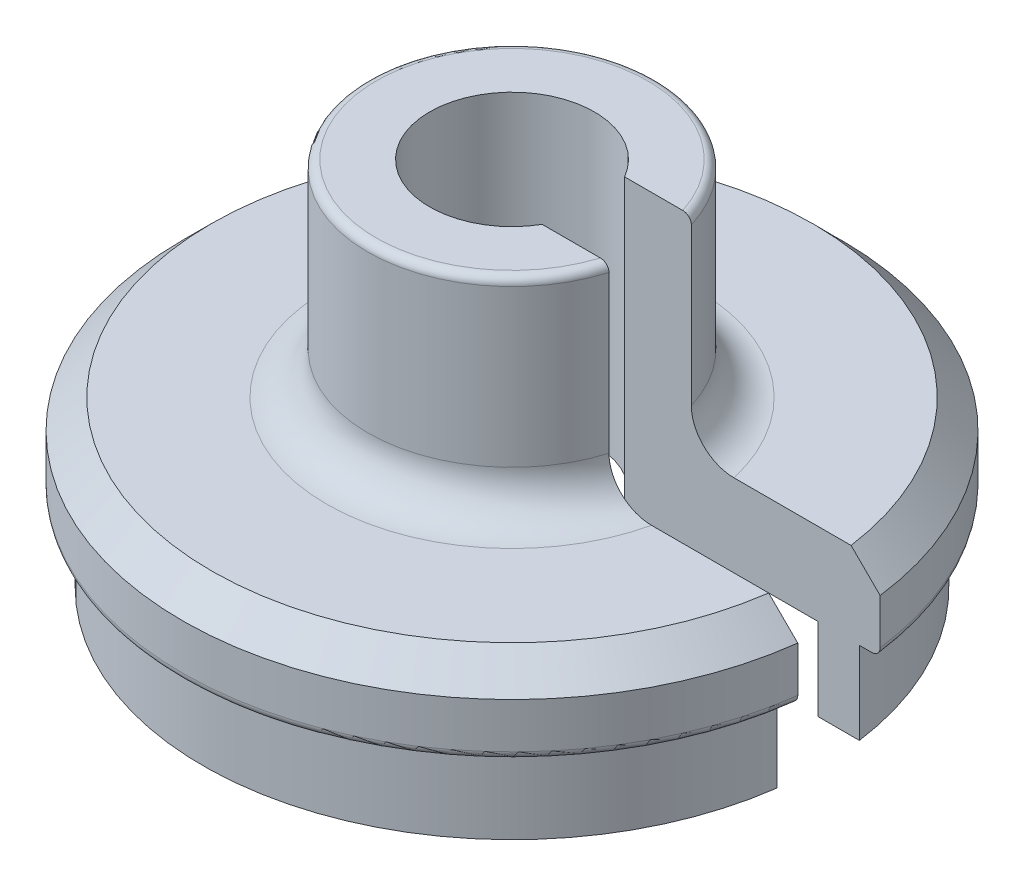
ISO-10303-21;
HEADER;
FILE_DESCRIPTION(('STEP AP214'),'2;1');
FILE_NAME('part.step','',(''),(''),'','','');
FILE_SCHEMA(('AUTOMOTIVE_DESIGN { 1 0 10303 214 1 1 1 1 }'));
ENDSEC;
DATA;
#1=APPLICATION_CONTEXT('core data for automotive mechanical design processes');
#2=APPLICATION_PROTOCOL_DEFINITION('international standard','automotive_design',2000,#1);
#3=PRODUCT_CONTEXT('',#1,'mechanical');
#4=PRODUCT('Part','Part','',(#3));
#5=PRODUCT_RELATED_PRODUCT_CATEGORY('part','',(#4));
#6=PRODUCT_DEFINITION_FORMATION('','',#4);
#7=PRODUCT_DEFINITION_CONTEXT('part definition',#1,'design');
#8=PRODUCT_DEFINITION('design','',#6,#7);
#9=PRODUCT_DEFINITION_SHAPE('','',#8);
#10=(LENGTH_UNIT() NAMED_UNIT(*) SI_UNIT(.MILLI.,.METRE.));
#11=(NAMED_UNIT(*) PLANE_ANGLE_UNIT() SI_UNIT($,.RADIAN.));
#12=(NAMED_UNIT(*) SI_UNIT($,.STERADIAN.) SOLID_ANGLE_UNIT());
#13=UNCERTAINTY_MEASURE_WITH_UNIT(LENGTH_MEASURE(1.E-05),#10,'distance_accuracy_value','');
#14=(GEOMETRIC_REPRESENTATION_CONTEXT(3) GLOBAL_UNCERTAINTY_ASSIGNED_CONTEXT((#13)) GLOBAL_UNIT_ASSIGNED_CONTEXT((#10,
#11,#12)) REPRESENTATION_CONTEXT('',''));
#15=CARTESIAN_POINT('',(0.,0.,0.));
#16=DIRECTION('',(0.,0.,1.));
#17=DIRECTION('',(1.,0.,0.));
#18=AXIS2_PLACEMENT_3D('',#15,#16,#17);
#19=CARTESIAN_POINT('',(-11.5961538461538,-2.,0.));
#20=DIRECTION('',(0.,1.,0.));
#21=DIRECTION('',(-1.,0.,0.));
#22=AXIS2_PLACEMENT_3D('',#19,#20,#21);
#23=PLANE('',#22);
#24=CARTESIAN_POINT('',(-3.59615384615383,-2.,0.));
#25=DIRECTION('',(0.,1.,0.));
#26=DIRECTION('',(1.,0.,0.));
#27=AXIS2_PLACEMENT_3D('',#24,#25,#26);
#28=CIRCLE('',#27,6.5);
#29=CARTESIAN_POINT('',(2.82646244317873,-2.,-1.));
#30=VERTEX_POINT('',#29);
#31=CARTESIAN_POINT('',(2.82646244317873,-2.,1.));
#32=VERTEX_POINT('',#31);
#33=EDGE_CURVE('E164',#30,#32,#28,.T.);
#34=ORIENTED_EDGE('',*,*,#33,.F.);
#35=DIRECTION('',(1.,0.,0.));
#36=VECTOR('',#35,1.);
#37=CARTESIAN_POINT('',(-11.5961538461538,-2.,-1.));
#38=LINE('',#37,#36);
#39=CARTESIAN_POINT('',(-1.86410303858496,-2.,-1.));
#40=VERTEX_POINT('',#39);
#41=EDGE_CURVE('E202',#40,#30,#38,.T.);
#42=ORIENTED_EDGE('',*,*,#41,.F.);
#43=CARTESIAN_POINT('',(-3.59615384615383,-2.,0.));
#44=DIRECTION('',(0.,1.,0.));
#45=DIRECTION('',(-1.,0.,0.));
#46=AXIS2_PLACEMENT_3D('',#43,#44,#45);
#47=CIRCLE('',#46,2.);
#48=CARTESIAN_POINT('',(-1.86410303858496,-2.,1.));
#49=VERTEX_POINT('',#48);
#50=EDGE_CURVE('E192',#40,#49,#47,.T.);
#51=ORIENTED_EDGE('',*,*,#50,.T.);
#52=DIRECTION('',(1.,0.,0.));
#53=VECTOR('',#52,1.);
#54=CARTESIAN_POINT('',(-11.5961538461538,-2.,1.));
#55=LINE('',#54,#53);
#56=EDGE_CURVE('E199',#49,#32,#55,.T.);
#57=ORIENTED_EDGE('',*,*,#56,.T.);
#58=EDGE_LOOP('',(#34,#42,#51,#57));
#59=FACE_BOUND('',#58,.T.);
#60=ADVANCED_FACE('F36',(#59),#23,.F.);
#61=CARTESIAN_POINT('',(-3.59615384615383,-2.,0.));
#62=DIRECTION('',(0.,-1.,0.));
#63=DIRECTION('',(1.,0.,0.));
#64=AXIS2_PLACEMENT_3D('',#61,#62,#63);
#65=CIRCLE('',#64,7.5);
#66=CARTESIAN_POINT('',(3.83688052750542,-2.,1.));
#67=VERTEX_POINT('',#66);
#68=CARTESIAN_POINT('',(3.83688052750542,-2.,-1.));
#69=VERTEX_POINT('',#68);
#70=EDGE_CURVE('E160',#67,#69,#65,.T.);
#71=ORIENTED_EDGE('',*,*,#70,.F.);
#72=CARTESIAN_POINT('',(4.13947799617165,-2.,1.));
#73=VERTEX_POINT('',#72);
#74=EDGE_CURVE('E198',#67,#73,#55,.T.);
#75=ORIENTED_EDGE('',*,*,#74,.T.);
#76=CARTESIAN_POINT('',(-3.59615384615383,-2.,0.));
#77=DIRECTION('',(0.,1.,0.));
#78=DIRECTION('',(-1.,0.,0.));
#79=AXIS2_PLACEMENT_3D('',#76,#77,#78);
#80=CIRCLE('',#79,7.8);
#81=CARTESIAN_POINT('',(4.13947799617165,-2.,-1.));
#82=VERTEX_POINT('',#81);
#83=EDGE_CURVE('E251',#73,#82,#80,.F.);
#84=ORIENTED_EDGE('',*,*,#83,.T.);
#85=EDGE_CURVE('E201',#69,#82,#38,.T.);
#86=ORIENTED_EDGE('',*,*,#85,.F.);
#87=EDGE_LOOP('',(#71,#75,#84,#86));
#88=FACE_BOUND('',#87,.T.);
#89=ADVANCED_FACE('F322',(#88),#23,.F.);
#90=CARTESIAN_POINT('',(-3.59615384615384,17.5350422674797,0.));
#91=DIRECTION('',(0.,1.,0.));
#92=DIRECTION('',(-1.,0.,0.));
#93=AXIS2_PLACEMENT_3D('',#90,#91,#92);
#94=CYLINDRICAL_SURFACE('',#93,2.);
#95=DIRECTION('',(0.,1.,0.));
#96=VECTOR('',#95,1.);
#97=CARTESIAN_POINT('',(-1.86410303858496,17.5350422674797,-1.));
#98=LINE('',#97,#96);
#99=CARTESIAN_POINT('',(-1.86410303858496,5.,-1.));
#100=VERTEX_POINT('',#99);
#101=EDGE_CURVE('E190',#100,#40,#98,.F.);
#102=ORIENTED_EDGE('',*,*,#101,.F.);
#103=CARTESIAN_POINT('',(-3.59615384615383,5.,0.));
#104=DIRECTION('',(0.,1.,0.));
#105=DIRECTION('',(-1.,0.,0.));
#106=AXIS2_PLACEMENT_3D('',#103,#104,#105);
#107=CIRCLE('',#106,2.);
#108=CARTESIAN_POINT('',(-1.86410303858496,5.,1.));
#109=VERTEX_POINT('',#108);
#110=EDGE_CURVE('E195',#100,#109,#107,.T.);
#111=ORIENTED_EDGE('',*,*,#110,.T.);
#112=DIRECTION('',(0.,1.,0.));
#113=VECTOR('',#112,1.);
#114=CARTESIAN_POINT('',(-1.86410303858496,17.5350422674797,1.));
#115=LINE('',#114,#113);
#116=EDGE_CURVE('E178',#109,#49,#115,.F.);
#117=ORIENTED_EDGE('',*,*,#116,.T.);
#118=ORIENTED_EDGE('',*,*,#50,.F.);
#119=EDGE_LOOP('',(#102,#111,#117,#118));
#120=FACE_BOUND('',#119,.T.);
#121=ADVANCED_FACE('F336',(#120),#94,.F.);
#122=CARTESIAN_POINT('',(-5.59615384615383,5.,0.));
#123=DIRECTION('',(0.,-1.,0.));
#124=DIRECTION('',(1.,0.,0.));
#125=AXIS2_PLACEMENT_3D('',#122,#123,#124);
#126=PLANE('',#125);
#127=DIRECTION('',(-1.,0.,0.));
#128=VECTOR('',#127,1.);
#129=CARTESIAN_POINT('',(-5.59615384615383,5.,-1.));
#130=LINE('',#129,#128);
#131=CARTESIAN_POINT('',(-0.451316807450556,5.,-1.));
#132=VERTEX_POINT('',#131);
#133=EDGE_CURVE('E188',#132,#100,#130,.T.);
#134=ORIENTED_EDGE('',*,*,#133,.F.);
#135=CARTESIAN_POINT('',(-3.59615384615383,5.,0.));
#136=DIRECTION('',(0.,-1.,0.));
#137=DIRECTION('',(1.,0.,0.));
#138=AXIS2_PLACEMENT_3D('',#135,#136,#137);
#139=CIRCLE('',#138,3.3);
#140=CARTESIAN_POINT('',(-0.451316807450556,5.,1.));
#141=VERTEX_POINT('',#140);
#142=EDGE_CURVE('E205',#132,#141,#139,.F.);
#143=ORIENTED_EDGE('',*,*,#142,.T.);
#144=DIRECTION('',(-1.,0.,0.));
#145=VECTOR('',#144,1.);
#146=CARTESIAN_POINT('',(-5.59615384615383,5.,1.));
#147=LINE('',#146,#145);
#148=EDGE_CURVE('E176',#141,#109,#147,.T.);
#149=ORIENTED_EDGE('',*,*,#148,.T.);
#150=ORIENTED_EDGE('',*,*,#110,.F.);
#151=EDGE_LOOP('',(#134,#143,#149,#150));
#152=FACE_BOUND('',#151,.T.);
#153=ADVANCED_FACE('F339',(#152),#126,.F.);
#154=CARTESIAN_POINT('',(-3.59615384615384,17.5350422674797,0.));
#155=DIRECTION('',(0.,1.,0.));
#156=DIRECTION('',(-1.,0.,0.));
#157=AXIS2_PLACEMENT_3D('',#154,#155,#156);
#158=CYLINDRICAL_SURFACE('',#157,3.5);
#159=DIRECTION('',(0.,1.,0.));
#160=VECTOR('',#159,1.);
#161=CARTESIAN_POINT('',(-0.242051879904151,17.5350422674797,-1.));
#162=LINE('',#161,#160);
#163=CARTESIAN_POINT('',(-0.242051879904149,1.,-1.));
#164=VERTEX_POINT('',#163);
#165=CARTESIAN_POINT('',(-0.242051879904149,4.8,-1.));
#166=VERTEX_POINT('',#165);
#167=EDGE_CURVE('E186',#164,#166,#162,.T.);
#168=ORIENTED_EDGE('',*,*,#167,.F.);
#169=CARTESIAN_POINT('',(-3.59615384615383,1.,0.));
#170=DIRECTION('',(0.,-1.,0.));
#171=DIRECTION('',(1.,0.,0.));
#172=AXIS2_PLACEMENT_3D('',#169,#170,#171);
#173=CIRCLE('',#172,3.5);
#174=CARTESIAN_POINT('',(-0.242051879904149,1.,1.));
#175=VERTEX_POINT('',#174);
#176=EDGE_CURVE('E268',#164,#175,#173,.F.);
#177=ORIENTED_EDGE('',*,*,#176,.T.);
#178=DIRECTION('',(0.,1.,0.));
#179=VECTOR('',#178,1.);
#180=CARTESIAN_POINT('',(-0.242051879904151,17.5350422674797,1.));
#181=LINE('',#180,#179);
#182=CARTESIAN_POINT('',(-0.242051879904149,4.8,1.));
#183=VERTEX_POINT('',#182);
#184=EDGE_CURVE('E174',#175,#183,#181,.T.);
#185=ORIENTED_EDGE('',*,*,#184,.T.);
#186=CARTESIAN_POINT('',(-3.59615384615383,4.8,0.));
#187=DIRECTION('',(0.,-1.,0.));
#188=DIRECTION('',(1.,0.,0.));
#189=AXIS2_PLACEMENT_3D('',#186,#187,#188);
#190=CIRCLE('',#189,3.5);
#191=EDGE_CURVE('E217',#183,#166,#190,.T.);
#192=ORIENTED_EDGE('',*,*,#191,.T.);
#193=EDGE_LOOP('',(#168,#177,#185,#192));
#194=FACE_BOUND('',#193,.T.);
#195=ADVANCED_FACE('F289',(#194),#158,.T.);
#196=CARTESIAN_POINT('',(-7.09615384615383,0.,0.));
#197=DIRECTION('',(0.,-1.,0.));
#198=DIRECTION('',(1.,0.,0.));
#199=AXIS2_PLACEMENT_3D('',#196,#197,#198);
#200=PLANE('',#199);
#201=DIRECTION('',(-1.,0.,0.));
#202=VECTOR('',#201,1.);
#203=CARTESIAN_POINT('',(-7.09615384615383,0.,1.));
#204=LINE('',#203,#202);
#205=CARTESIAN_POINT('',(3.63502862976253,0.,1.));
#206=VERTEX_POINT('',#205);
#207=CARTESIAN_POINT('',(0.791328347542228,0.,1.));
#208=VERTEX_POINT('',#207);
#209=EDGE_CURVE('E168',#206,#208,#204,.T.);
#210=ORIENTED_EDGE('',*,*,#209,.T.);
#211=CARTESIAN_POINT('',(-3.59615384615383,0.,0.));
#212=DIRECTION('',(0.,-1.,0.));
#213=DIRECTION('',(1.,0.,0.));
#214=AXIS2_PLACEMENT_3D('',#211,#212,#213);
#215=CIRCLE('',#214,4.5);
#216=CARTESIAN_POINT('',(0.791328347542228,0.,-1.));
#217=VERTEX_POINT('',#216);
#218=EDGE_CURVE('E271',#208,#217,#215,.T.);
#219=ORIENTED_EDGE('',*,*,#218,.T.);
#220=DIRECTION('',(-1.,0.,0.));
#221=VECTOR('',#220,1.);
#222=CARTESIAN_POINT('',(-7.09615384615383,0.,-1.));
#223=LINE('',#222,#221);
#224=CARTESIAN_POINT('',(3.63502862976253,0.,-1.));
#225=VERTEX_POINT('',#224);
#226=EDGE_CURVE('E183',#225,#217,#223,.T.);
#227=ORIENTED_EDGE('',*,*,#226,.F.);
#228=CARTESIAN_POINT('',(-3.59615384615383,0.,0.));
#229=DIRECTION('',(0.,-1.,0.));
#230=DIRECTION('',(1.,0.,0.));
#231=AXIS2_PLACEMENT_3D('',#228,#229,#230);
#232=CIRCLE('',#231,7.29999999999999);
#233=EDGE_CURVE('E298',#225,#206,#232,.F.);
#234=ORIENTED_EDGE('',*,*,#233,.T.);
#235=EDGE_LOOP('',(#210,#219,#227,#234));
#236=FACE_BOUND('',#235,.T.);
#237=ADVANCED_FACE('F279',(#236),#200,.F.);
#238=CARTESIAN_POINT('',(-3.59615384615384,17.5350422674797,0.));
#239=DIRECTION('',(0.,1.,0.));
#240=DIRECTION('',(-1.,0.,0.));
#241=AXIS2_PLACEMENT_3D('',#238,#239,#240);
#242=CYLINDRICAL_SURFACE('',#241,8.);
#243=DIRECTION('',(0.,1.,0.));
#244=VECTOR('',#243,1.);
#245=CARTESIAN_POINT('',(4.34110008703994,17.5350422674797,-1.));
#246=LINE('',#245,#244);
#247=CARTESIAN_POINT('',(4.34110008703994,-1.8,-1.));
#248=VERTEX_POINT('',#247);
#249=CARTESIAN_POINT('',(4.34110008703994,-0.700000000000006,-1.));
#250=VERTEX_POINT('',#249);
#251=EDGE_CURVE('E181',#248,#250,#246,.T.);
#252=ORIENTED_EDGE('',*,*,#251,.F.);
#253=CARTESIAN_POINT('',(-3.59615384615383,-1.8,0.));
#254=DIRECTION('',(0.,1.,0.));
#255=DIRECTION('',(-1.,0.,0.));
#256=AXIS2_PLACEMENT_3D('',#253,#254,#255);
#257=CIRCLE('',#256,8.);
#258=CARTESIAN_POINT('',(4.34110008703994,-1.8,1.));
#259=VERTEX_POINT('',#258);
#260=EDGE_CURVE('E252',#248,#259,#257,.T.);
#261=ORIENTED_EDGE('',*,*,#260,.T.);
#262=DIRECTION('',(0.,1.,0.));
#263=VECTOR('',#262,1.);
#264=CARTESIAN_POINT('',(4.34110008703994,17.5350422674797,1.));
#265=LINE('',#264,#263);
#266=CARTESIAN_POINT('',(4.34110008703994,-0.700000000000006,1.));
#267=VERTEX_POINT('',#266);
#268=EDGE_CURVE('E166',#259,#267,#265,.T.);
#269=ORIENTED_EDGE('',*,*,#268,.T.);
#270=CARTESIAN_POINT('',(-3.59615384615383,-0.700000000000006,0.));
#271=DIRECTION('',(0.,-1.,0.));
#272=DIRECTION('',(0.,0.,-1.));
#273=AXIS2_PLACEMENT_3D('',#270,#271,#272);
#274=CIRCLE('',#273,8.);
#275=EDGE_CURVE('E305',#267,#250,#274,.T.);
#276=ORIENTED_EDGE('',*,*,#275,.T.);
#277=EDGE_LOOP('',(#252,#261,#269,#276));
#278=FACE_BOUND('',#277,.T.);
#279=ADVANCED_FACE('F227',(#278),#242,.T.);
#280=CARTESIAN_POINT('',(0.,0.,1.));
#281=DIRECTION('',(0.,0.,1.));
#282=DIRECTION('',(1.,0.,0.));
#283=AXIS2_PLACEMENT_3D('',#280,#281,#282);
#284=PLANE('',#283);
#285=ORIENTED_EDGE('',*,*,#268,.F.);
#286=CARTESIAN_POINT('',(4.34110008703994,-1.8,1.));
#287=CARTESIAN_POINT('',(4.34111000367303,-1.81118728351737,1.));
#288=CARTESIAN_POINT('',(4.34015461061808,-1.82237119974511,1.));
#289=CARTESIAN_POINT('',(4.33638699070919,-1.8444107116656,1.));
#290=CARTESIAN_POINT('',(4.3335766304921,-1.85526662595105,1.));
#291=CARTESIAN_POINT('',(4.32617109069924,-1.87635654890913,1.));
#292=CARTESIAN_POINT('',(4.32157518817818,-1.88659030373318,1.));
#293=CARTESIAN_POINT('',(4.31073744195693,-1.90614338787218,1.));
#294=CARTESIAN_POINT('',(4.30449578700032,-1.91546282187822,1.));
#295=CARTESIAN_POINT('',(4.29052279051971,-1.93296028102009,1.));
#296=CARTESIAN_POINT('',(4.28278647098573,-1.94113432992781,1.));
#297=CARTESIAN_POINT('',(4.26605879098557,-1.95608078984433,1.));
#298=CARTESIAN_POINT('',(4.25706716980379,-1.96285290895681,1.));
#299=CARTESIAN_POINT('',(4.23801330359846,-1.9748563717876,1.));
#300=CARTESIAN_POINT('',(4.2279434185825,-1.98007557465435,1.));
#301=CARTESIAN_POINT('',(4.20707637935956,-1.98876108699441,1.));
#302=CARTESIAN_POINT('',(4.19627956845006,-1.99222821741071,1.));
#303=CARTESIAN_POINT('',(4.17776814678508,-1.99651061390018,1.));
#304=CARTESIAN_POINT('',(4.17016367763265,-1.99781838069524,1.));
#305=CARTESIAN_POINT('',(4.15486645335653,-1.9995630024429,1.));
#306=CARTESIAN_POINT('',(4.14717383906136,-2.0000010924697,1.));
#307=CARTESIAN_POINT('',(4.13947799617197,-2.00000000000139,1.));
#308=B_SPLINE_CURVE_WITH_KNOTS('',3,(#286,#287,#288,#289,#290,#291,#292,#293,#294,#295,#296,
#297,#298,#299,#300,#301,#302,#303,#304,#305,#306,#307),.UNSPECIFIED.,.F.,.F.,(4,2,2,2,2,2,2,2,
2,2,4),(0.,0.0335162060994231,0.0669987364551787,0.100494837649731,0.133987099004161,
0.167592892234216,0.20120567551693,0.235074729773882,0.268927899754178,0.292029512326079,
0.315098293532271),.UNSPECIFIED.);
#309=EDGE_CURVE('E243',#259,#73,#308,.T.);
#310=ORIENTED_EDGE('',*,*,#309,.T.);
#311=ORIENTED_EDGE('',*,*,#74,.F.);
#312=DIRECTION('',(0.,1.,0.));
#313=VECTOR('',#312,1.);
#314=CARTESIAN_POINT('',(3.83688052750542,-4.,1.));
#315=LINE('',#314,#313);
#316=CARTESIAN_POINT('',(3.83688052750542,-4.,1.));
#317=VERTEX_POINT('',#316);
#318=EDGE_CURVE('E149',#317,#67,#315,.T.);
#319=ORIENTED_EDGE('',*,*,#318,.F.);
#320=DIRECTION('',(1.,0.,0.));
#321=VECTOR('',#320,1.);
#322=CARTESIAN_POINT('',(2.82646244317873,-4.,1.));
#323=LINE('',#322,#321);
#324=CARTESIAN_POINT('',(2.82646244317873,-4.,1.));
#325=VERTEX_POINT('',#324);
#326=EDGE_CURVE('E141',#325,#317,#323,.T.);
#327=ORIENTED_EDGE('',*,*,#326,.F.);
#328=DIRECTION('',(0.,1.,0.));
#329=VECTOR('',#328,1.);
#330=CARTESIAN_POINT('',(2.82646244317873,-4.,1.));
#331=LINE('',#330,#329);
#332=EDGE_CURVE('E146',#325,#32,#331,.T.);
#333=ORIENTED_EDGE('',*,*,#332,.T.);
#334=ORIENTED_EDGE('',*,*,#56,.F.);
#335=ORIENTED_EDGE('',*,*,#116,.F.);
#336=ORIENTED_EDGE('',*,*,#148,.F.);
#337=CARTESIAN_POINT('',(-0.451316807450557,5.,1.));
#338=CARTESIAN_POINT('',(-0.439118464422126,5.0000078415926,1.));
#339=CARTESIAN_POINT('',(-0.426918620990468,4.99898681834863,1.));
#340=CARTESIAN_POINT('',(-0.402848261648592,4.9949331270267,1.));
#341=CARTESIAN_POINT('',(-0.390978011646249,4.99189888119857,1.));
#342=CARTESIAN_POINT('',(-0.367906849591073,4.98386059888151,1.));
#343=CARTESIAN_POINT('',(-0.356706679204008,4.97885442461789,1.));
#344=CARTESIAN_POINT('',(-0.3353427279709,4.96698685157686,1.));
#345=CARTESIAN_POINT('',(-0.325178280095736,4.96012665736341,1.));
#346=CARTESIAN_POINT('',(-0.306464180603772,4.94491953932102,1.));
#347=CARTESIAN_POINT('',(-0.297879467876862,4.93661581903791,1.));
#348=CARTESIAN_POINT('',(-0.282301773919503,4.91862337895417,1.));
#349=CARTESIAN_POINT('',(-0.275308927129191,4.90893454228675,1.));
#350=CARTESIAN_POINT('',(-0.263442564292668,4.88890694019071,1.));
#351=CARTESIAN_POINT('',(-0.258489858935303,4.87861500862761,1.));
#352=CARTESIAN_POINT('',(-0.250462902243942,4.8573289112108,1.));
#353=CARTESIAN_POINT('',(-0.247386336161827,4.84633562925418,1.));
#354=CARTESIAN_POINT('',(-0.244222107149152,4.82936733771584,1.));
#355=CARTESIAN_POINT('',(-0.243408594696608,4.82351916344959,1.));
#356=CARTESIAN_POINT('',(-0.242323800627143,4.81178166330776,1.));
#357=CARTESIAN_POINT('',(-0.242051701829145,4.80589241293468,1.));
#358=CARTESIAN_POINT('',(-0.242051879904043,4.80000000000002,1.));
#359=B_SPLINE_CURVE_WITH_KNOTS('',3,(#337,#338,#339,#340,#341,#342,#343,#344,#345,#346,#347,
#348,#349,#350,#351,#352,#353,#354,#355,#356,#357,#358),.UNSPECIFIED.,.F.,.F.,(4,2,2,2,2,2,2,2,
2,2,4),(0.,0.0365552077901963,0.0731390975634225,0.109762757703388,0.146362680274877,
0.182012770498103,0.217665870413481,0.251762614395854,0.285817204841989,0.303508665859265,
0.321173404006044),.UNSPECIFIED.);
#360=EDGE_CURVE('E208',#141,#183,#359,.T.);
#361=ORIENTED_EDGE('',*,*,#360,.T.);
#362=ORIENTED_EDGE('',*,*,#184,.F.);
#363=CARTESIAN_POINT('',(-0.242051879904149,1.,1.));
#364=CARTESIAN_POINT('',(-0.242052501502991,0.9726448971356,1.));
#365=CARTESIAN_POINT('',(-0.240879810915997,0.945303294443922,1.));
#366=CARTESIAN_POINT('',(-0.236206846857198,0.890823903008961,1.));
#367=CARTESIAN_POINT('',(-0.232706931326186,0.863686083571652,1.));
#368=CARTESIAN_POINT('',(-0.218771800962682,0.782989720308295,1.));
#369=CARTESIAN_POINT('',(-0.204900943526184,0.729984957249375,1.));
#370=CARTESIAN_POINT('',(-0.168499475247995,0.627079240806251,1.));
#371=CARTESIAN_POINT('',(-0.145969148927832,0.577178185507049,1.));
#372=CARTESIAN_POINT('',(-0.0930150900118529,0.481745631433671,1.));
#373=CARTESIAN_POINT('',(-0.0625895407861952,0.436215141600165,1.));
#374=CARTESIAN_POINT('',(0.00589849598746728,0.34977666843558,1.));
#375=CARTESIAN_POINT('',(0.0441056179111522,0.308983459033309,1.));
#376=CARTESIAN_POINT('',(0.12661157418224,0.23410076633119,1.));
#377=CARTESIAN_POINT('',(0.17091208406443,0.200013133190181,1.));
#378=CARTESIAN_POINT('',(0.266120124990733,0.138203019295661,1.));
#379=CARTESIAN_POINT('',(0.31721237240082,0.110765140039969,1.));
#380=CARTESIAN_POINT('',(0.423195715466687,0.0646360609379344,1.));
#381=CARTESIAN_POINT('',(0.4780857576289,0.0459424465441406,1.));
#382=CARTESIAN_POINT('',(0.576141860617293,0.0212915092202071,1.));
#383=CARTESIAN_POINT('',(0.618813277442479,0.0133195428905755,1.));
#384=CARTESIAN_POINT('',(0.704760426673597,0.0026727836331244,1.));
#385=CARTESIAN_POINT('',(0.748035389472897,-8.22713107076836E-06,1.));
#386=CARTESIAN_POINT('',(0.791328347542228,0.,1.));
#387=B_SPLINE_CURVE_WITH_KNOTS('',3,(#363,#364,#365,#366,#367,#368,#369,#370,#371,#372,#373,
#374,#375,#376,#377,#378,#379,#380,#381,#382,#383,#384,#385,#386),.UNSPECIFIED.,.F.,.F.,(4,2,2,
2,2,2,2,2,2,2,2,4),(0.,0.0820135859399504,0.164014560628077,0.327532957529721,0.491045982216498,
0.654596663399905,0.821522250062518,0.988493829342256,1.16168886575982,1.33483604968639,
1.46475143839007,1.59451406172121),.UNSPECIFIED.);
#388=EDGE_CURVE('E50',#175,#208,#387,.T.);
#389=ORIENTED_EDGE('',*,*,#388,.T.);
#390=ORIENTED_EDGE('',*,*,#209,.F.);
#391=CARTESIAN_POINT('',(3.63502862976253,0.,1.));
#392=CARTESIAN_POINT('',(3.75275370175091,-0.116619768037187,1.));
#393=CARTESIAN_POINT('',(3.8704555259584,-0.233262985495132,1.));
#394=CARTESIAN_POINT('',(4.10581267838404,-0.466596318828638,1.));
#395=CARTESIAN_POINT('',(4.22346800660235,-0.583286434704029,1.));
#396=CARTESIAN_POINT('',(4.34110008703994,-0.700000000000007,1.));
#397=B_SPLINE_CURVE_WITH_KNOTS('',3,(#391,#392,#393,#394,#395,#396),.UNSPECIFIED.,.F.,.F.,(4,2,
4),(0.,0.49712597639473,0.9942519509832),.UNSPECIFIED.);
#398=EDGE_CURVE('E235',#206,#267,#397,.T.);
#399=ORIENTED_EDGE('',*,*,#398,.T.);
#400=EDGE_LOOP('',(#285,#310,#311,#319,#327,#333,#334,#335,#336,#361,#362,#389,#390,#399));
#401=FACE_BOUND('',#400,.T.);
#402=ADVANCED_FACE('F144',(#401),#284,.F.);
#403=CARTESIAN_POINT('',(0.,0.,-1.));
#404=DIRECTION('',(0.,0.,1.));
#405=DIRECTION('',(1.,0.,0.));
#406=AXIS2_PLACEMENT_3D('',#403,#404,#405);
#407=PLANE('',#406);
#408=ORIENTED_EDGE('',*,*,#41,.T.);
#409=DIRECTION('',(0.,1.,0.));
#410=VECTOR('',#409,1.);
#411=CARTESIAN_POINT('',(2.82646244317873,-4.,-1.));
#412=LINE('',#411,#410);
#413=CARTESIAN_POINT('',(2.82646244317873,-4.,-1.));
#414=VERTEX_POINT('',#413);
#415=EDGE_CURVE('E328',#414,#30,#412,.T.);
#416=ORIENTED_EDGE('',*,*,#415,.F.);
#417=DIRECTION('',(-1.,0.,0.));
#418=VECTOR('',#417,1.);
#419=CARTESIAN_POINT('',(2.82646244317873,-4.,-1.));
#420=LINE('',#419,#418);
#421=CARTESIAN_POINT('',(3.83688052750542,-4.,-1.));
#422=VERTEX_POINT('',#421);
#423=EDGE_CURVE('E157',#422,#414,#420,.T.);
#424=ORIENTED_EDGE('',*,*,#423,.F.);
#425=DIRECTION('',(0.,1.,0.));
#426=VECTOR('',#425,1.);
#427=CARTESIAN_POINT('',(3.83688052750542,-4.,-1.));
#428=LINE('',#427,#426);
#429=EDGE_CURVE('E57',#422,#69,#428,.T.);
#430=ORIENTED_EDGE('',*,*,#429,.T.);
#431=ORIENTED_EDGE('',*,*,#85,.T.);
#432=CARTESIAN_POINT('',(4.13947799617165,-2.,-1.));
#433=CARTESIAN_POINT('',(4.15088902611521,-2.00000925678232,-1.));
#434=CARTESIAN_POINT('',(4.16229780636715,-1.99904000032171,-1.));
#435=CARTESIAN_POINT('',(4.18478776597503,-1.99521160079993,-1.));
#436=CARTESIAN_POINT('',(4.19586911803785,-1.99235347333791,-1.));
#437=CARTESIAN_POINT('',(4.2174001993788,-1.98481218932829,-1.));
#438=CARTESIAN_POINT('',(4.22784956484279,-1.98012799290876,-1.));
#439=CARTESIAN_POINT('',(4.24780709368886,-1.96906671281772,-1.));
#440=CARTESIAN_POINT('',(4.25731548909095,-1.96269004790221,-1.));
#441=CARTESIAN_POINT('',(4.27508166077491,-1.94844754100191,-1.));
#442=CARTESIAN_POINT('',(4.28334417854172,-1.94058761516914,-1.));
#443=CARTESIAN_POINT('',(4.29842168176783,-1.92358060159526,-1.));
#444=CARTESIAN_POINT('',(4.30523640612232,-1.9144332821706,-1.));
#445=CARTESIAN_POINT('',(4.3171677012082,-1.89518725011721,-1.));
#446=CARTESIAN_POINT('',(4.32229660244991,-1.88509617225655,-1.));
#447=CARTESIAN_POINT('',(4.3307707863848,-1.86419436869534,-1.));
#448=CARTESIAN_POINT('',(4.33411731615602,-1.85338415213,-1.));
#449=CARTESIAN_POINT('',(4.33804447789489,-1.83541617820866,-1.));
#450=CARTESIAN_POINT('',(4.33918965555626,-1.82837680398455,-1.));
#451=CARTESIAN_POINT('',(4.34071731079641,-1.81422599510806,-1.));
#452=CARTESIAN_POINT('',(4.34110087735874,-1.80711467797756,-1.));
#453=CARTESIAN_POINT('',(4.34110008704059,-1.80000000000015,-1.));
#454=B_SPLINE_CURVE_WITH_KNOTS('',3,(#432,#433,#434,#435,#436,#437,#438,#439,#440,#441,#442,
#443,#444,#445,#446,#447,#448,#449,#450,#451,#452,#453),.UNSPECIFIED.,.F.,.F.,(4,2,2,2,2,2,2,2,
2,2,4),(0.,0.0341888834963359,0.0683593994162242,0.102549402545368,0.136730954146872,
0.170778945107331,0.204833071308715,0.238632267664434,0.272407784448825,0.293765493661075,
0.315092642669224),.UNSPECIFIED.);
#455=EDGE_CURVE('E262',#82,#248,#454,.T.);
#456=ORIENTED_EDGE('',*,*,#455,.T.);
#457=ORIENTED_EDGE('',*,*,#251,.T.);
#458=CARTESIAN_POINT('',(4.34110008703994,-0.700000000000006,-1.));
#459=CARTESIAN_POINT('',(4.22346800660234,-0.583286434704029,-1.));
#460=CARTESIAN_POINT('',(4.10581267838403,-0.466596318828638,-1.));
#461=CARTESIAN_POINT('',(3.8704555259584,-0.233262985495131,-1.));
#462=CARTESIAN_POINT('',(3.75275370175091,-0.116619768037186,-1.));
#463=CARTESIAN_POINT('',(3.63502862976253,0.,-1.));
#464=B_SPLINE_CURVE_WITH_KNOTS('',3,(#458,#459,#460,#461,#462,#463),.UNSPECIFIED.,.F.,.F.,(4,2,
4),(0.,0.49712597458847,0.9942519509832),.UNSPECIFIED.);
#465=EDGE_CURVE('E286',#250,#225,#464,.T.);
#466=ORIENTED_EDGE('',*,*,#465,.T.);
#467=ORIENTED_EDGE('',*,*,#226,.T.);
#468=CARTESIAN_POINT('',(0.791328347542228,0.,-1.));
#469=CARTESIAN_POINT('',(0.732013320728872,-4.14427987303028E-05,-1.));
#470=CARTESIAN_POINT('',(0.672715259621284,0.0050144486175068,-1.));
#471=CARTESIAN_POINT('',(0.555812925826165,0.0249518252221267,-1.));
#472=CARTESIAN_POINT('',(0.498208084723865,0.0398299728004198,-1.));
#473=CARTESIAN_POINT('',(0.386284610505992,0.0790519897251816,-1.));
#474=CARTESIAN_POINT('',(0.33196745253078,0.103400072253432,-1.));
#475=CARTESIAN_POINT('',(0.228227993786277,0.160910424641305,-1.));
#476=CARTESIAN_POINT('',(0.178804639452276,0.19407079165661,-1.));
#477=CARTESIAN_POINT('',(0.0866156302783033,0.268138800442826,-1.));
#478=CARTESIAN_POINT('',(0.0438129410484656,0.309000282445232,-1.));
#479=CARTESIAN_POINT('',(-0.0340918547211452,0.397528506984571,-1.));
#480=CARTESIAN_POINT('',(-0.0691932516429456,0.445195875966943,-1.));
#481=CARTESIAN_POINT('',(-0.129560772790368,0.544545670432634,-1.));
#482=CARTESIAN_POINT('',(-0.155077748756839,0.596075757672871,-1.));
#483=CARTESIAN_POINT('',(-0.196682354540248,0.702783525797194,-1.));
#484=CARTESIAN_POINT('',(-0.212781250225978,0.757956760438645,-1.));
#485=CARTESIAN_POINT('',(-0.229906675240946,0.844692947222418,-1.));
#486=CARTESIAN_POINT('',(-0.23445789127943,0.875598639043762,-1.));
#487=CARTESIAN_POINT('',(-0.240529554824436,0.937664113184369,-1.));
#488=CARTESIAN_POINT('',(-0.242054076358913,0.96882349718599,-1.));
#489=CARTESIAN_POINT('',(-0.242051879904193,0.999999999999993,-1.));
#490=B_SPLINE_CURVE_WITH_KNOTS('',3,(#468,#469,#470,#471,#472,#473,#474,#475,#476,#477,#478,
#479,#480,#481,#482,#483,#484,#485,#486,#487,#488,#489),.UNSPECIFIED.,.F.,.F.,(4,2,2,2,2,2,2,2,
2,2,4),(0.,0.177707093718665,0.355353833491474,0.533079699017527,0.710767219180197,
0.887421746979609,1.06409254537689,1.23574946653816,1.40720063030914,1.50078551536829,
1.5942443465321),.UNSPECIFIED.);
#491=EDGE_CURVE('E11',#217,#164,#490,.T.);
#492=ORIENTED_EDGE('',*,*,#491,.T.);
#493=ORIENTED_EDGE('',*,*,#167,.T.);
#494=CARTESIAN_POINT('',(-0.242051879904149,4.8,-1.));
#495=CARTESIAN_POINT('',(-0.242040520114087,4.81090745804686,-1.));
#496=CARTESIAN_POINT('',(-0.242982231299336,4.82180946114631,-1.));
#497=CARTESIAN_POINT('',(-0.246684852538591,4.843279488269,-1.));
#498=CARTESIAN_POINT('',(-0.249442292548988,4.85384810912756,-1.));
#499=CARTESIAN_POINT('',(-0.256690362999048,4.87437312733413,-1.));
#500=CARTESIAN_POINT('',(-0.26118115432172,4.88432946775315,-1.));
#501=CARTESIAN_POINT('',(-0.271742560243586,4.903364966325,-1.));
#502=CARTESIAN_POINT('',(-0.277813392894577,4.91244400316924,-1.));
#503=CARTESIAN_POINT('',(-0.29146001205065,4.92964386199338,-1.));
#504=CARTESIAN_POINT('',(-0.299059729709421,4.93774567144974,-1.));
#505=CARTESIAN_POINT('',(-0.315465694402559,4.95261824572765,-1.));
#506=CARTESIAN_POINT('',(-0.324272215912464,4.95938870689182,-1.));
#507=CARTESIAN_POINT('',(-0.343211882029318,4.97169381074814,-1.));
#508=CARTESIAN_POINT('',(-0.353383838137305,4.97716865147495,-1.));
#509=CARTESIAN_POINT('',(-0.374476497859854,4.9864109794959,-1.));
#510=CARTESIAN_POINT('',(-0.385397256533571,4.99017834108445,-1.));
#511=CARTESIAN_POINT('',(-0.405484761211042,4.99536657133283,-1.));
#512=CARTESIAN_POINT('',(-0.414571385928877,4.99710410945366,-1.));
#513=CARTESIAN_POINT('',(-0.432877140059709,4.99942085190591,-1.));
#514=CARTESIAN_POINT('',(-0.442096046294555,5.00000181848571,-1.));
#515=CARTESIAN_POINT('',(-0.451316807450557,5.,-1.));
#516=B_SPLINE_CURVE_WITH_KNOTS('',3,(#494,#495,#496,#497,#498,#499,#500,#501,#502,#503,#504,
#505,#506,#507,#508,#509,#510,#511,#512,#513,#514,#515),.UNSPECIFIED.,.F.,.F.,(4,2,2,2,2,2,2,2,
2,2,4),(0.,0.0326734875042294,0.0652847131527858,0.0978989663781542,0.130517722884995,
0.163693546517056,0.196876928222662,0.231378983271757,0.265883577969508,0.293565960726525,
0.3212061319259),.UNSPECIFIED.);
#517=EDGE_CURVE('E297',#166,#132,#516,.T.);
#518=ORIENTED_EDGE('',*,*,#517,.T.);
#519=ORIENTED_EDGE('',*,*,#133,.T.);
#520=ORIENTED_EDGE('',*,*,#101,.T.);
#521=EDGE_LOOP('',(#408,#416,#424,#430,#431,#456,#457,#466,#467,#492,#493,#518,#519,#520));
#522=FACE_BOUND('',#521,.T.);
#523=ADVANCED_FACE('F226',(#522),#407,.T.);
#524=CARTESIAN_POINT('',(-3.59615384615383,4.8,0.));
#525=DIRECTION('',(0.,-1.,0.));
#526=DIRECTION('',(1.,0.,0.));
#527=AXIS2_PLACEMENT_3D('',#524,#525,#526);
#528=TOROIDAL_SURFACE('',#527,3.3,0.2);
#529=ORIENTED_EDGE('',*,*,#517,.F.);
#530=ORIENTED_EDGE('',*,*,#191,.F.);
#531=ORIENTED_EDGE('',*,*,#360,.F.);
#532=ORIENTED_EDGE('',*,*,#142,.F.);
#533=EDGE_LOOP('',(#529,#530,#531,#532));
#534=FACE_BOUND('',#533,.T.);
#535=ADVANCED_FACE('F219',(#534),#528,.T.);
#536=CARTESIAN_POINT('',(-3.59615384615383,0.,0.));
#537=DIRECTION('',(0.,-1.,0.));
#538=DIRECTION('',(0.,0.,-1.));
#539=AXIS2_PLACEMENT_3D('',#536,#537,#538);
#540=CONICAL_SURFACE('',#539,7.3,0.785398163397446);
#541=ORIENTED_EDGE('',*,*,#465,.F.);
#542=ORIENTED_EDGE('',*,*,#275,.F.);
#543=ORIENTED_EDGE('',*,*,#398,.F.);
#544=ORIENTED_EDGE('',*,*,#233,.F.);
#545=EDGE_LOOP('',(#541,#542,#543,#544));
#546=FACE_BOUND('',#545,.T.);
#547=ADVANCED_FACE('F258',(#546),#540,.T.);
#548=CARTESIAN_POINT('',(-3.59615384615383,-1.8,0.));
#549=DIRECTION('',(0.,1.,0.));
#550=DIRECTION('',(-1.,0.,0.));
#551=AXIS2_PLACEMENT_3D('',#548,#549,#550);
#552=TOROIDAL_SURFACE('',#551,7.8,0.2);
#553=ORIENTED_EDGE('',*,*,#455,.F.);
#554=ORIENTED_EDGE('',*,*,#83,.F.);
#555=ORIENTED_EDGE('',*,*,#309,.F.);
#556=ORIENTED_EDGE('',*,*,#260,.F.);
#557=EDGE_LOOP('',(#553,#554,#555,#556));
#558=FACE_BOUND('',#557,.T.);
#559=ADVANCED_FACE('F255',(#558),#552,.T.);
#560=CARTESIAN_POINT('',(-3.59615384615383,1.,0.));
#561=DIRECTION('',(0.,-1.,0.));
#562=DIRECTION('',(1.,0.,0.));
#563=AXIS2_PLACEMENT_3D('',#560,#561,#562);
#564=TOROIDAL_SURFACE('',#563,4.5,1.);
#565=ORIENTED_EDGE('',*,*,#491,.F.);
#566=ORIENTED_EDGE('',*,*,#218,.F.);
#567=ORIENTED_EDGE('',*,*,#388,.F.);
#568=ORIENTED_EDGE('',*,*,#176,.F.);
#569=EDGE_LOOP('',(#565,#566,#567,#568));
#570=FACE_BOUND('',#569,.T.);
#571=ADVANCED_FACE('F38',(#570),#564,.F.);
#572=CARTESIAN_POINT('',(-3.59615384615383,-4.,0.));
#573=DIRECTION('',(0.,1.,0.));
#574=DIRECTION('',(-1.,0.,0.));
#575=AXIS2_PLACEMENT_3D('',#572,#573,#574);
#576=CYLINDRICAL_SURFACE('',#575,6.5);
#577=ORIENTED_EDGE('',*,*,#33,.T.);
#578=ORIENTED_EDGE('',*,*,#332,.F.);
#579=CARTESIAN_POINT('',(-3.59615384615383,-4.,0.));
#580=DIRECTION('',(0.,1.,0.));
#581=DIRECTION('',(1.,0.,0.));
#582=AXIS2_PLACEMENT_3D('',#579,#580,#581);
#583=CIRCLE('',#582,6.5);
#584=EDGE_CURVE('E153',#414,#325,#583,.T.);
#585=ORIENTED_EDGE('',*,*,#584,.F.);
#586=ORIENTED_EDGE('',*,*,#415,.T.);
#587=EDGE_LOOP('',(#577,#578,#585,#586));
#588=FACE_BOUND('',#587,.T.);
#589=ADVANCED_FACE('F162',(#588),#576,.F.);
#590=CARTESIAN_POINT('',(-3.59615384615383,-4.,0.));
#591=DIRECTION('',(0.,1.,0.));
#592=DIRECTION('',(-1.,0.,0.));
#593=AXIS2_PLACEMENT_3D('',#590,#591,#592);
#594=CYLINDRICAL_SURFACE('',#593,7.5);
#595=ORIENTED_EDGE('',*,*,#70,.T.);
#596=ORIENTED_EDGE('',*,*,#429,.F.);
#597=CARTESIAN_POINT('',(-3.59615384615383,-4.,0.));
#598=DIRECTION('',(0.,-1.,0.));
#599=DIRECTION('',(1.,0.,0.));
#600=AXIS2_PLACEMENT_3D('',#597,#598,#599);
#601=CIRCLE('',#600,7.5);
#602=EDGE_CURVE('E152',#317,#422,#601,.T.);
#603=ORIENTED_EDGE('',*,*,#602,.F.);
#604=ORIENTED_EDGE('',*,*,#318,.T.);
#605=EDGE_LOOP('',(#595,#596,#603,#604));
#606=FACE_BOUND('',#605,.T.);
#607=ADVANCED_FACE('F330',(#606),#594,.T.);
#608=CARTESIAN_POINT('',(-3.59615384615383,-4.,0.));
#609=DIRECTION('',(0.,-1.,0.));
#610=DIRECTION('',(1.,0.,0.));
#611=AXIS2_PLACEMENT_3D('',#608,#609,#610);
#612=PLANE('',#611);
#613=ORIENTED_EDGE('',*,*,#584,.T.);
#614=ORIENTED_EDGE('',*,*,#326,.T.);
#615=ORIENTED_EDGE('',*,*,#602,.T.);
#616=ORIENTED_EDGE('',*,*,#423,.T.);
#617=EDGE_LOOP('',(#613,#614,#615,#616));
#618=FACE_BOUND('',#617,.T.);
#619=ADVANCED_FACE('F156',(#618),#612,.T.);
#620=CLOSED_SHELL('',(#60,#89,#121,#153,#195,#237,#279,#402,#523,#535,#547,#559,#571,#589,#607,#619));
#621=MANIFOLD_SOLID_BREP('B2',#620);
#622=ADVANCED_BREP_SHAPE_REPRESENTATION('',(#18,#621),#14);
#623=SHAPE_DEFINITION_REPRESENTATION(#9,#622);
ENDSEC;
END-ISO-10303-21;
